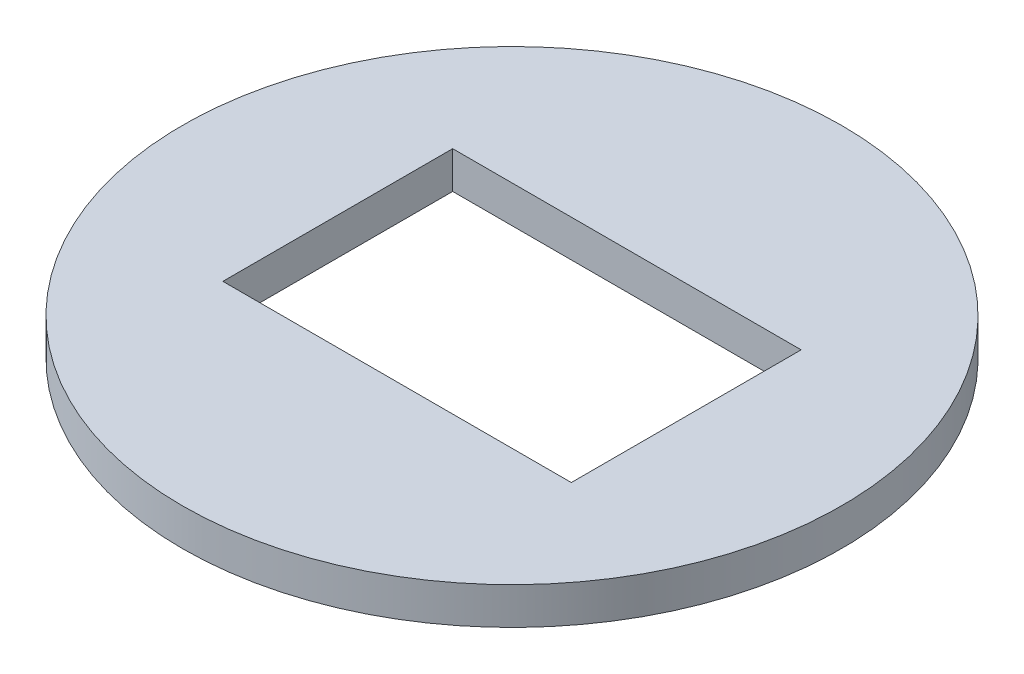
ISO-10303-21;
HEADER;
FILE_DESCRIPTION(('STEP AP214'),'2;1');
FILE_NAME('part.step','',(''),(''),'','','');
FILE_SCHEMA(('AUTOMOTIVE_DESIGN { 1 0 10303 214 1 1 1 1 }'));
ENDSEC;
DATA;
#1=APPLICATION_CONTEXT('core data for automotive mechanical design processes');
#2=APPLICATION_PROTOCOL_DEFINITION('international standard','automotive_design',2000,#1);
#3=PRODUCT_CONTEXT('',#1,'mechanical');
#4=PRODUCT('Part','Part','',(#3));
#5=PRODUCT_RELATED_PRODUCT_CATEGORY('part','',(#4));
#6=PRODUCT_DEFINITION_FORMATION('','',#4);
#7=PRODUCT_DEFINITION_CONTEXT('part definition',#1,'design');
#8=PRODUCT_DEFINITION('design','',#6,#7);
#9=PRODUCT_DEFINITION_SHAPE('','',#8);
#10=(LENGTH_UNIT() NAMED_UNIT(*) SI_UNIT(.MILLI.,.METRE.));
#11=(NAMED_UNIT(*) PLANE_ANGLE_UNIT() SI_UNIT($,.RADIAN.));
#12=(NAMED_UNIT(*) SI_UNIT($,.STERADIAN.) SOLID_ANGLE_UNIT());
#13=UNCERTAINTY_MEASURE_WITH_UNIT(LENGTH_MEASURE(1.E-05),#10,'distance_accuracy_value','');
#14=(GEOMETRIC_REPRESENTATION_CONTEXT(3) GLOBAL_UNCERTAINTY_ASSIGNED_CONTEXT((#13)) GLOBAL_UNIT_ASSIGNED_CONTEXT((#10,
#11,#12)) REPRESENTATION_CONTEXT('',''));
#15=CARTESIAN_POINT('',(0.,0.,0.));
#16=DIRECTION('',(0.,0.,1.));
#17=DIRECTION('',(1.,0.,0.));
#18=AXIS2_PLACEMENT_3D('',#15,#16,#17);
#19=CARTESIAN_POINT('',(0.,10.,0.));
#20=DIRECTION('',(0.,-1.,0.));
#21=DIRECTION('',(0.,0.,-1.));
#22=AXIS2_PLACEMENT_3D('',#19,#20,#21);
#23=CYLINDRICAL_SURFACE('',#22,88.9);
#24=CARTESIAN_POINT('',(0.,10.,0.));
#25=DIRECTION('',(0.,1.,0.));
#26=DIRECTION('',(0.,0.,1.));
#27=AXIS2_PLACEMENT_3D('',#24,#25,#26);
#28=CIRCLE('',#27,88.9);
#29=CARTESIAN_POINT('',(0.,10.,88.9));
#30=VERTEX_POINT('',#29);
#31=EDGE_CURVE('E11',#30,#30,#28,.T.);
#32=ORIENTED_EDGE('',*,*,#31,.F.);
#33=EDGE_LOOP('',(#32));
#34=FACE_BOUND('',#33,.T.);
#35=CARTESIAN_POINT('',(0.,0.,0.));
#36=DIRECTION('',(0.,1.,0.));
#37=DIRECTION('',(0.,0.,1.));
#38=AXIS2_PLACEMENT_3D('',#35,#36,#37);
#39=CIRCLE('',#38,88.9);
#40=CARTESIAN_POINT('',(0.,0.,88.9));
#41=VERTEX_POINT('',#40);
#42=EDGE_CURVE('E35',#41,#41,#39,.T.);
#43=ORIENTED_EDGE('',*,*,#42,.T.);
#44=EDGE_LOOP('',(#43));
#45=FACE_BOUND('',#44,.T.);
#46=ADVANCED_FACE('F32',(#34,#45),#23,.T.);
#47=CARTESIAN_POINT('',(0.,10.,0.));
#48=DIRECTION('',(0.,1.,0.));
#49=DIRECTION('',(0.,0.,1.));
#50=AXIS2_PLACEMENT_3D('',#47,#48,#49);
#51=PLANE('',#50);
#52=DIRECTION('',(0.,0.,-1.));
#53=VECTOR('',#52,1.);
#54=CARTESIAN_POINT('',(47.,10.,0.));
#55=LINE('',#54,#53);
#56=CARTESIAN_POINT('',(47.,10.,31.));
#57=VERTEX_POINT('',#56);
#58=CARTESIAN_POINT('',(47.,10.,-31.));
#59=VERTEX_POINT('',#58);
#60=EDGE_CURVE('E105',#57,#59,#55,.T.);
#61=ORIENTED_EDGE('',*,*,#60,.F.);
#62=DIRECTION('',(1.,0.,0.));
#63=VECTOR('',#62,1.);
#64=CARTESIAN_POINT('',(0.,10.,31.));
#65=LINE('',#64,#63);
#66=CARTESIAN_POINT('',(-47.,10.,31.));
#67=VERTEX_POINT('',#66);
#68=EDGE_CURVE('E98',#67,#57,#65,.T.);
#69=ORIENTED_EDGE('',*,*,#68,.F.);
#70=DIRECTION('',(0.,0.,1.));
#71=VECTOR('',#70,1.);
#72=CARTESIAN_POINT('',(-47.,10.,0.));
#73=LINE('',#72,#71);
#74=CARTESIAN_POINT('',(-47.,10.,-31.));
#75=VERTEX_POINT('',#74);
#76=EDGE_CURVE('E78',#75,#67,#73,.T.);
#77=ORIENTED_EDGE('',*,*,#76,.F.);
#78=DIRECTION('',(-1.,0.,0.));
#79=VECTOR('',#78,1.);
#80=CARTESIAN_POINT('',(0.,10.,-31.));
#81=LINE('',#80,#79);
#82=EDGE_CURVE('E103',#59,#75,#81,.T.);
#83=ORIENTED_EDGE('',*,*,#82,.F.);
#84=EDGE_LOOP('',(#61,#69,#77,#83));
#85=FACE_BOUND('',#84,.T.);
#86=ORIENTED_EDGE('',*,*,#31,.T.);
#87=EDGE_LOOP('',(#86));
#88=FACE_BOUND('',#87,.T.);
#89=ADVANCED_FACE('F113',(#85,#88),#51,.T.);
#90=CARTESIAN_POINT('',(0.,0.,0.));
#91=DIRECTION('',(0.,1.,0.));
#92=DIRECTION('',(0.,0.,1.));
#93=AXIS2_PLACEMENT_3D('',#90,#91,#92);
#94=PLANE('',#93);
#95=DIRECTION('',(-1.,0.,0.));
#96=VECTOR('',#95,1.);
#97=CARTESIAN_POINT('',(-47.,0.,31.));
#98=LINE('',#97,#96);
#99=CARTESIAN_POINT('',(47.,0.,31.));
#100=VERTEX_POINT('',#99);
#101=CARTESIAN_POINT('',(-47.,0.,31.));
#102=VERTEX_POINT('',#101);
#103=EDGE_CURVE('E84',#100,#102,#98,.T.);
#104=ORIENTED_EDGE('',*,*,#103,.F.);
#105=DIRECTION('',(0.,0.,1.));
#106=VECTOR('',#105,1.);
#107=CARTESIAN_POINT('',(47.,0.,31.));
#108=LINE('',#107,#106);
#109=CARTESIAN_POINT('',(47.,0.,-31.));
#110=VERTEX_POINT('',#109);
#111=EDGE_CURVE('E54',#110,#100,#108,.T.);
#112=ORIENTED_EDGE('',*,*,#111,.F.);
#113=DIRECTION('',(1.,0.,0.));
#114=VECTOR('',#113,1.);
#115=CARTESIAN_POINT('',(-47.,0.,-31.));
#116=LINE('',#115,#114);
#117=CARTESIAN_POINT('',(-47.,0.,-31.));
#118=VERTEX_POINT('',#117);
#119=EDGE_CURVE('E91',#118,#110,#116,.T.);
#120=ORIENTED_EDGE('',*,*,#119,.F.);
#121=DIRECTION('',(0.,0.,-1.));
#122=VECTOR('',#121,1.);
#123=CARTESIAN_POINT('',(-47.,0.,31.));
#124=LINE('',#123,#122);
#125=EDGE_CURVE('E75',#102,#118,#124,.T.);
#126=ORIENTED_EDGE('',*,*,#125,.F.);
#127=EDGE_LOOP('',(#104,#112,#120,#126));
#128=FACE_BOUND('',#127,.T.);
#129=ORIENTED_EDGE('',*,*,#42,.F.);
#130=EDGE_LOOP('',(#129));
#131=FACE_BOUND('',#130,.T.);
#132=ADVANCED_FACE('F88',(#128,#131),#94,.F.);
#133=CARTESIAN_POINT('',(47.,30.,31.));
#134=DIRECTION('',(1.,0.,0.));
#135=DIRECTION('',(0.,0.,-1.));
#136=AXIS2_PLACEMENT_3D('',#133,#134,#135);
#137=PLANE('',#136);
#138=ORIENTED_EDGE('',*,*,#60,.T.);
#139=DIRECTION('',(0.,-1.,0.));
#140=VECTOR('',#139,1.);
#141=CARTESIAN_POINT('',(47.,30.,-31.));
#142=LINE('',#141,#140);
#143=EDGE_CURVE('E96',#59,#110,#142,.T.);
#144=ORIENTED_EDGE('',*,*,#143,.T.);
#145=ORIENTED_EDGE('',*,*,#111,.T.);
#146=DIRECTION('',(0.,-1.,0.));
#147=VECTOR('',#146,1.);
#148=CARTESIAN_POINT('',(47.,30.,31.));
#149=LINE('',#148,#147);
#150=EDGE_CURVE('E81',#57,#100,#149,.T.);
#151=ORIENTED_EDGE('',*,*,#150,.F.);
#152=EDGE_LOOP('',(#138,#144,#145,#151));
#153=FACE_BOUND('',#152,.T.);
#154=ADVANCED_FACE('F112',(#153),#137,.F.);
#155=CARTESIAN_POINT('',(-47.,30.,-31.));
#156=DIRECTION('',(0.,0.,-1.));
#157=DIRECTION('',(-1.,0.,0.));
#158=AXIS2_PLACEMENT_3D('',#155,#156,#157);
#159=PLANE('',#158);
#160=ORIENTED_EDGE('',*,*,#82,.T.);
#161=DIRECTION('',(0.,-1.,0.));
#162=VECTOR('',#161,1.);
#163=CARTESIAN_POINT('',(-47.,30.,-31.));
#164=LINE('',#163,#162);
#165=EDGE_CURVE('E80',#75,#118,#164,.T.);
#166=ORIENTED_EDGE('',*,*,#165,.T.);
#167=ORIENTED_EDGE('',*,*,#119,.T.);
#168=ORIENTED_EDGE('',*,*,#143,.F.);
#169=EDGE_LOOP('',(#160,#166,#167,#168));
#170=FACE_BOUND('',#169,.T.);
#171=ADVANCED_FACE('F119',(#170),#159,.F.);
#172=CARTESIAN_POINT('',(-47.,30.,31.));
#173=DIRECTION('',(-1.,0.,0.));
#174=DIRECTION('',(0.,0.,1.));
#175=AXIS2_PLACEMENT_3D('',#172,#173,#174);
#176=PLANE('',#175);
#177=ORIENTED_EDGE('',*,*,#76,.T.);
#178=DIRECTION('',(0.,-1.,0.));
#179=VECTOR('',#178,1.);
#180=CARTESIAN_POINT('',(-47.,30.,31.));
#181=LINE('',#180,#179);
#182=EDGE_CURVE('E46',#67,#102,#181,.T.);
#183=ORIENTED_EDGE('',*,*,#182,.T.);
#184=ORIENTED_EDGE('',*,*,#125,.T.);
#185=ORIENTED_EDGE('',*,*,#165,.F.);
#186=EDGE_LOOP('',(#177,#183,#184,#185));
#187=FACE_BOUND('',#186,.T.);
#188=ADVANCED_FACE('F72',(#187),#176,.F.);
#189=CARTESIAN_POINT('',(-47.,30.,31.));
#190=DIRECTION('',(0.,0.,1.));
#191=DIRECTION('',(1.,0.,0.));
#192=AXIS2_PLACEMENT_3D('',#189,#190,#191);
#193=PLANE('',#192);
#194=ORIENTED_EDGE('',*,*,#68,.T.);
#195=ORIENTED_EDGE('',*,*,#150,.T.);
#196=ORIENTED_EDGE('',*,*,#103,.T.);
#197=ORIENTED_EDGE('',*,*,#182,.F.);
#198=EDGE_LOOP('',(#194,#195,#196,#197));
#199=FACE_BOUND('',#198,.T.);
#200=ADVANCED_FACE('F85',(#199),#193,.F.);
#201=CLOSED_SHELL('',(#46,#89,#132,#154,#171,#188,#200));
#202=MANIFOLD_SOLID_BREP('B2',#201);
#203=ADVANCED_BREP_SHAPE_REPRESENTATION('',(#18,#202),#14);
#204=SHAPE_DEFINITION_REPRESENTATION(#9,#203);
ENDSEC;
END-ISO-10303-21;
